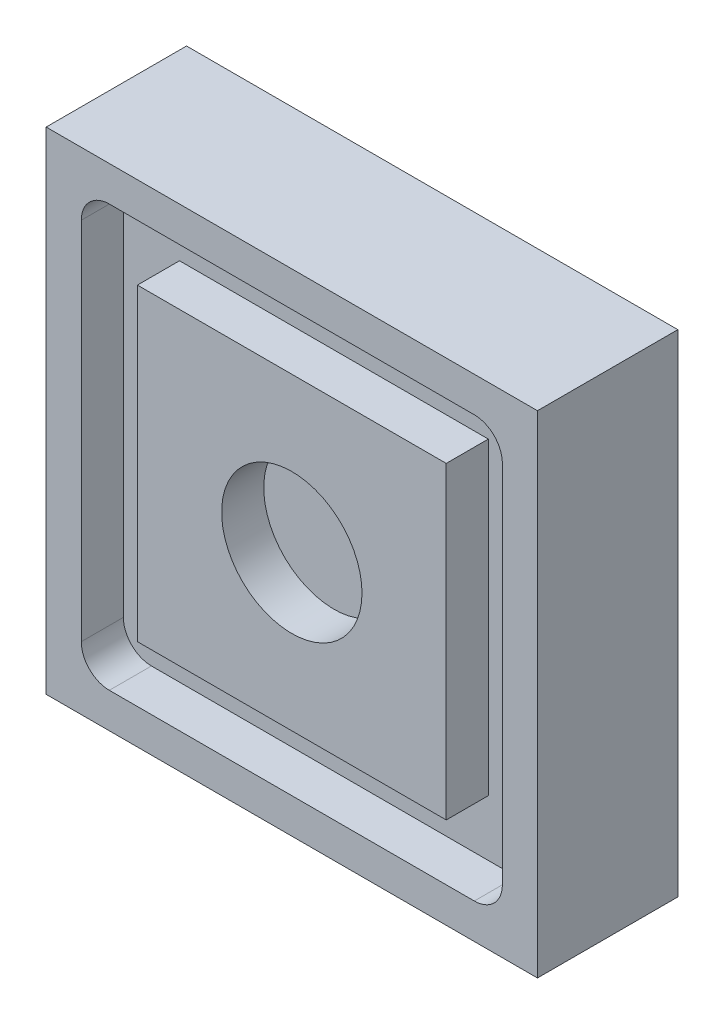
ISO-10303-21;
HEADER;
FILE_DESCRIPTION(('STEP AP214'),'2;1');
FILE_NAME('part.step','',(''),(''),'','','');
FILE_SCHEMA(('AUTOMOTIVE_DESIGN { 1 0 10303 214 1 1 1 1 }'));
ENDSEC;
DATA;
#1=APPLICATION_CONTEXT('core data for automotive mechanical design processes');
#2=APPLICATION_PROTOCOL_DEFINITION('international standard','automotive_design',2000,#1);
#3=PRODUCT_CONTEXT('',#1,'mechanical');
#4=PRODUCT('Part','Part','',(#3));
#5=PRODUCT_RELATED_PRODUCT_CATEGORY('part','',(#4));
#6=PRODUCT_DEFINITION_FORMATION('','',#4);
#7=PRODUCT_DEFINITION_CONTEXT('part definition',#1,'design');
#8=PRODUCT_DEFINITION('design','',#6,#7);
#9=PRODUCT_DEFINITION_SHAPE('','',#8);
#10=(LENGTH_UNIT() NAMED_UNIT(*) SI_UNIT(.MILLI.,.METRE.));
#11=(NAMED_UNIT(*) PLANE_ANGLE_UNIT() SI_UNIT($,.RADIAN.));
#12=(NAMED_UNIT(*) SI_UNIT($,.STERADIAN.) SOLID_ANGLE_UNIT());
#13=UNCERTAINTY_MEASURE_WITH_UNIT(LENGTH_MEASURE(1.E-05),#10,'distance_accuracy_value','');
#14=(GEOMETRIC_REPRESENTATION_CONTEXT(3) GLOBAL_UNCERTAINTY_ASSIGNED_CONTEXT((#13)) GLOBAL_UNIT_ASSIGNED_CONTEXT((#10,
#11,#12)) REPRESENTATION_CONTEXT('',''));
#15=CARTESIAN_POINT('',(0.,0.,0.));
#16=DIRECTION('',(0.,0.,1.));
#17=DIRECTION('',(1.,0.,0.));
#18=AXIS2_PLACEMENT_3D('',#15,#16,#17);
#19=CARTESIAN_POINT('',(-17.5,-17.5,10.));
#20=DIRECTION('',(1.,0.,0.));
#21=DIRECTION('',(0.,0.,-1.));
#22=AXIS2_PLACEMENT_3D('',#19,#20,#21);
#23=PLANE('',#22);
#24=DIRECTION('',(0.,-1.,0.));
#25=VECTOR('',#24,1.);
#26=CARTESIAN_POINT('',(-17.5,-17.5,0.));
#27=LINE('',#26,#25);
#28=CARTESIAN_POINT('',(-17.5,17.5,0.));
#29=VERTEX_POINT('',#28);
#30=CARTESIAN_POINT('',(-17.5,-17.5,0.));
#31=VERTEX_POINT('',#30);
#32=EDGE_CURVE('E395',#29,#31,#27,.T.);
#33=ORIENTED_EDGE('',*,*,#32,.T.);
#34=DIRECTION('',(0.,0.,-1.));
#35=VECTOR('',#34,1.);
#36=CARTESIAN_POINT('',(-17.5,-17.5,10.));
#37=LINE('',#36,#35);
#38=CARTESIAN_POINT('',(-17.5,-17.5,10.));
#39=VERTEX_POINT('',#38);
#40=EDGE_CURVE('E13',#39,#31,#37,.T.);
#41=ORIENTED_EDGE('',*,*,#40,.F.);
#42=DIRECTION('',(0.,-1.,0.));
#43=VECTOR('',#42,1.);
#44=CARTESIAN_POINT('',(-17.5,-17.5,10.));
#45=LINE('',#44,#43);
#46=CARTESIAN_POINT('',(-17.5,17.5,10.));
#47=VERTEX_POINT('',#46);
#48=EDGE_CURVE('E346',#47,#39,#45,.T.);
#49=ORIENTED_EDGE('',*,*,#48,.F.);
#50=DIRECTION('',(0.,0.,-1.));
#51=VECTOR('',#50,1.);
#52=CARTESIAN_POINT('',(-17.5,17.5,10.));
#53=LINE('',#52,#51);
#54=EDGE_CURVE('E436',#47,#29,#53,.T.);
#55=ORIENTED_EDGE('',*,*,#54,.T.);
#56=EDGE_LOOP('',(#33,#41,#49,#55));
#57=FACE_BOUND('',#56,.T.);
#58=ADVANCED_FACE('F82',(#57),#23,.F.);
#59=CARTESIAN_POINT('',(17.5,-17.5,10.));
#60=DIRECTION('',(0.,1.,0.));
#61=DIRECTION('',(-1.,0.,0.));
#62=AXIS2_PLACEMENT_3D('',#59,#60,#61);
#63=PLANE('',#62);
#64=DIRECTION('',(1.,0.,0.));
#65=VECTOR('',#64,1.);
#66=CARTESIAN_POINT('',(17.5,-17.5,0.));
#67=LINE('',#66,#65);
#68=CARTESIAN_POINT('',(17.5,-17.5,0.));
#69=VERTEX_POINT('',#68);
#70=EDGE_CURVE('E437',#31,#69,#67,.T.);
#71=ORIENTED_EDGE('',*,*,#70,.T.);
#72=DIRECTION('',(0.,0.,-1.));
#73=VECTOR('',#72,1.);
#74=CARTESIAN_POINT('',(17.5,-17.5,10.));
#75=LINE('',#74,#73);
#76=CARTESIAN_POINT('',(17.5,-17.5,10.));
#77=VERTEX_POINT('',#76);
#78=EDGE_CURVE('E86',#77,#69,#75,.T.);
#79=ORIENTED_EDGE('',*,*,#78,.F.);
#80=DIRECTION('',(1.,0.,0.));
#81=VECTOR('',#80,1.);
#82=CARTESIAN_POINT('',(17.5,-17.5,10.));
#83=LINE('',#82,#81);
#84=EDGE_CURVE('E462',#39,#77,#83,.T.);
#85=ORIENTED_EDGE('',*,*,#84,.F.);
#86=ORIENTED_EDGE('',*,*,#40,.T.);
#87=EDGE_LOOP('',(#71,#79,#85,#86));
#88=FACE_BOUND('',#87,.T.);
#89=ADVANCED_FACE('F425',(#88),#63,.F.);
#90=CARTESIAN_POINT('',(17.5,-17.5,10.));
#91=DIRECTION('',(-1.,0.,0.));
#92=DIRECTION('',(0.,0.,1.));
#93=AXIS2_PLACEMENT_3D('',#90,#91,#92);
#94=PLANE('',#93);
#95=DIRECTION('',(0.,1.,0.));
#96=VECTOR('',#95,1.);
#97=CARTESIAN_POINT('',(17.5,-17.5,0.));
#98=LINE('',#97,#96);
#99=CARTESIAN_POINT('',(17.5,17.5,0.));
#100=VERTEX_POINT('',#99);
#101=EDGE_CURVE('E439',#69,#100,#98,.T.);
#102=ORIENTED_EDGE('',*,*,#101,.T.);
#103=DIRECTION('',(0.,0.,-1.));
#104=VECTOR('',#103,1.);
#105=CARTESIAN_POINT('',(17.5,17.5,10.));
#106=LINE('',#105,#104);
#107=CARTESIAN_POINT('',(17.5,17.5,10.));
#108=VERTEX_POINT('',#107);
#109=EDGE_CURVE('E446',#108,#100,#106,.T.);
#110=ORIENTED_EDGE('',*,*,#109,.F.);
#111=DIRECTION('',(0.,1.,0.));
#112=VECTOR('',#111,1.);
#113=CARTESIAN_POINT('',(17.5,-17.5,10.));
#114=LINE('',#113,#112);
#115=EDGE_CURVE('E456',#77,#108,#114,.T.);
#116=ORIENTED_EDGE('',*,*,#115,.F.);
#117=ORIENTED_EDGE('',*,*,#78,.T.);
#118=EDGE_LOOP('',(#102,#110,#116,#117));
#119=FACE_BOUND('',#118,.T.);
#120=ADVANCED_FACE('F428',(#119),#94,.F.);
#121=CARTESIAN_POINT('',(17.5,17.5,10.));
#122=DIRECTION('',(0.,-1.,0.));
#123=DIRECTION('',(1.,0.,0.));
#124=AXIS2_PLACEMENT_3D('',#121,#122,#123);
#125=PLANE('',#124);
#126=DIRECTION('',(-1.,0.,0.));
#127=VECTOR('',#126,1.);
#128=CARTESIAN_POINT('',(17.5,17.5,0.));
#129=LINE('',#128,#127);
#130=EDGE_CURVE('E449',#100,#29,#129,.T.);
#131=ORIENTED_EDGE('',*,*,#130,.T.);
#132=ORIENTED_EDGE('',*,*,#54,.F.);
#133=DIRECTION('',(-1.,0.,0.));
#134=VECTOR('',#133,1.);
#135=CARTESIAN_POINT('',(17.5,17.5,10.));
#136=LINE('',#135,#134);
#137=EDGE_CURVE('E444',#108,#47,#136,.T.);
#138=ORIENTED_EDGE('',*,*,#137,.F.);
#139=ORIENTED_EDGE('',*,*,#109,.T.);
#140=EDGE_LOOP('',(#131,#132,#138,#139));
#141=FACE_BOUND('',#140,.T.);
#142=ADVANCED_FACE('F458',(#141),#125,.F.);
#143=CARTESIAN_POINT('',(0.,0.,10.));
#144=DIRECTION('',(0.,0.,1.));
#145=DIRECTION('',(1.,0.,0.));
#146=AXIS2_PLACEMENT_3D('',#143,#144,#145);
#147=PLANE('',#146);
#148=CARTESIAN_POINT('',(-13.,-13.,10.));
#149=DIRECTION('',(0.,0.,1.));
#150=DIRECTION('',(-1.,0.,0.));
#151=AXIS2_PLACEMENT_3D('',#148,#149,#150);
#152=CIRCLE('',#151,2.);
#153=CARTESIAN_POINT('',(-15.,-13.,10.));
#154=VERTEX_POINT('',#153);
#155=CARTESIAN_POINT('',(-13.,-15.,10.));
#156=VERTEX_POINT('',#155);
#157=EDGE_CURVE('E92',#154,#156,#152,.T.);
#158=ORIENTED_EDGE('',*,*,#157,.F.);
#159=DIRECTION('',(0.,-1.,0.));
#160=VECTOR('',#159,1.);
#161=CARTESIAN_POINT('',(-15.,-13.,10.));
#162=LINE('',#161,#160);
#163=CARTESIAN_POINT('',(-15.,13.,10.));
#164=VERTEX_POINT('',#163);
#165=EDGE_CURVE('E310',#164,#154,#162,.T.);
#166=ORIENTED_EDGE('',*,*,#165,.F.);
#167=CARTESIAN_POINT('',(-13.,13.,10.));
#168=DIRECTION('',(0.,0.,1.));
#169=DIRECTION('',(1.,0.,0.));
#170=AXIS2_PLACEMENT_3D('',#167,#168,#169);
#171=CIRCLE('',#170,2.);
#172=CARTESIAN_POINT('',(-13.,15.,10.));
#173=VERTEX_POINT('',#172);
#174=EDGE_CURVE('E296',#173,#164,#171,.T.);
#175=ORIENTED_EDGE('',*,*,#174,.F.);
#176=DIRECTION('',(-1.,0.,0.));
#177=VECTOR('',#176,1.);
#178=CARTESIAN_POINT('',(13.,15.,10.));
#179=LINE('',#178,#177);
#180=CARTESIAN_POINT('',(13.,15.,10.));
#181=VERTEX_POINT('',#180);
#182=EDGE_CURVE('E292',#181,#173,#179,.T.);
#183=ORIENTED_EDGE('',*,*,#182,.F.);
#184=CARTESIAN_POINT('',(13.,13.,10.));
#185=DIRECTION('',(0.,0.,1.));
#186=DIRECTION('',(1.,0.,0.));
#187=AXIS2_PLACEMENT_3D('',#184,#185,#186);
#188=CIRCLE('',#187,2.);
#189=CARTESIAN_POINT('',(15.,13.,10.));
#190=VERTEX_POINT('',#189);
#191=EDGE_CURVE('E286',#190,#181,#188,.T.);
#192=ORIENTED_EDGE('',*,*,#191,.F.);
#193=DIRECTION('',(0.,1.,0.));
#194=VECTOR('',#193,1.);
#195=CARTESIAN_POINT('',(15.,-13.,10.));
#196=LINE('',#195,#194);
#197=CARTESIAN_POINT('',(15.,-13.,10.));
#198=VERTEX_POINT('',#197);
#199=EDGE_CURVE('E295',#198,#190,#196,.T.);
#200=ORIENTED_EDGE('',*,*,#199,.F.);
#201=CARTESIAN_POINT('',(13.,-13.,10.));
#202=DIRECTION('',(0.,0.,1.));
#203=DIRECTION('',(1.,0.,0.));
#204=AXIS2_PLACEMENT_3D('',#201,#202,#203);
#205=CIRCLE('',#204,2.);
#206=CARTESIAN_POINT('',(13.,-15.,10.));
#207=VERTEX_POINT('',#206);
#208=EDGE_CURVE('E269',#207,#198,#205,.T.);
#209=ORIENTED_EDGE('',*,*,#208,.F.);
#210=DIRECTION('',(1.,0.,0.));
#211=VECTOR('',#210,1.);
#212=CARTESIAN_POINT('',(13.,-15.,10.));
#213=LINE('',#212,#211);
#214=EDGE_CURVE('E270',#156,#207,#213,.T.);
#215=ORIENTED_EDGE('',*,*,#214,.F.);
#216=EDGE_LOOP('',(#158,#166,#175,#183,#192,#200,#209,#215));
#217=FACE_BOUND('',#216,.T.);
#218=ORIENTED_EDGE('',*,*,#48,.T.);
#219=ORIENTED_EDGE('',*,*,#84,.T.);
#220=ORIENTED_EDGE('',*,*,#115,.T.);
#221=ORIENTED_EDGE('',*,*,#137,.T.);
#222=EDGE_LOOP('',(#218,#219,#220,#221));
#223=FACE_BOUND('',#222,.T.);
#224=ADVANCED_FACE('F374',(#217,#223),#147,.T.);
#225=CARTESIAN_POINT('',(0.,0.,0.));
#226=DIRECTION('',(0.,0.,1.));
#227=DIRECTION('',(1.,0.,0.));
#228=AXIS2_PLACEMENT_3D('',#225,#226,#227);
#229=PLANE('',#228);
#230=ORIENTED_EDGE('',*,*,#32,.F.);
#231=ORIENTED_EDGE('',*,*,#130,.F.);
#232=ORIENTED_EDGE('',*,*,#101,.F.);
#233=ORIENTED_EDGE('',*,*,#70,.F.);
#234=EDGE_LOOP('',(#230,#231,#232,#233));
#235=FACE_BOUND('',#234,.T.);
#236=ADVANCED_FACE('F407',(#235),#229,.F.);
#237=CARTESIAN_POINT('',(-13.,-13.,7.));
#238=DIRECTION('',(0.,0.,1.));
#239=DIRECTION('',(1.,0.,0.));
#240=AXIS2_PLACEMENT_3D('',#237,#238,#239);
#241=CYLINDRICAL_SURFACE('',#240,2.);
#242=ORIENTED_EDGE('',*,*,#157,.T.);
#243=DIRECTION('',(0.,0.,1.));
#244=VECTOR('',#243,1.);
#245=CARTESIAN_POINT('',(-13.,-15.,7.));
#246=LINE('',#245,#244);
#247=CARTESIAN_POINT('',(-13.,-15.,7.));
#248=VERTEX_POINT('',#247);
#249=EDGE_CURVE('E338',#248,#156,#246,.T.);
#250=ORIENTED_EDGE('',*,*,#249,.F.);
#251=CARTESIAN_POINT('',(-13.,-13.,7.));
#252=DIRECTION('',(0.,0.,1.));
#253=DIRECTION('',(-1.,0.,0.));
#254=AXIS2_PLACEMENT_3D('',#251,#252,#253);
#255=CIRCLE('',#254,2.);
#256=CARTESIAN_POINT('',(-15.,-13.,7.));
#257=VERTEX_POINT('',#256);
#258=EDGE_CURVE('E301',#257,#248,#255,.T.);
#259=ORIENTED_EDGE('',*,*,#258,.F.);
#260=DIRECTION('',(0.,0.,1.));
#261=VECTOR('',#260,1.);
#262=CARTESIAN_POINT('',(-15.,-13.,7.));
#263=LINE('',#262,#261);
#264=EDGE_CURVE('E393',#257,#154,#263,.T.);
#265=ORIENTED_EDGE('',*,*,#264,.T.);
#266=EDGE_LOOP('',(#242,#250,#259,#265));
#267=FACE_BOUND('',#266,.T.);
#268=ADVANCED_FACE('F406',(#267),#241,.F.);
#269=CARTESIAN_POINT('',(-15.,-13.,7.));
#270=DIRECTION('',(-1.,0.,0.));
#271=DIRECTION('',(0.,0.,1.));
#272=AXIS2_PLACEMENT_3D('',#269,#270,#271);
#273=PLANE('',#272);
#274=ORIENTED_EDGE('',*,*,#165,.T.);
#275=ORIENTED_EDGE('',*,*,#264,.F.);
#276=DIRECTION('',(0.,-1.,0.));
#277=VECTOR('',#276,1.);
#278=CARTESIAN_POINT('',(-15.,-13.,7.));
#279=LINE('',#278,#277);
#280=CARTESIAN_POINT('',(-15.,13.,7.));
#281=VERTEX_POINT('',#280);
#282=EDGE_CURVE('E273',#281,#257,#279,.T.);
#283=ORIENTED_EDGE('',*,*,#282,.F.);
#284=DIRECTION('',(0.,0.,1.));
#285=VECTOR('',#284,1.);
#286=CARTESIAN_POINT('',(-15.,13.,7.));
#287=LINE('',#286,#285);
#288=EDGE_CURVE('E391',#281,#164,#287,.T.);
#289=ORIENTED_EDGE('',*,*,#288,.T.);
#290=EDGE_LOOP('',(#274,#275,#283,#289));
#291=FACE_BOUND('',#290,.T.);
#292=ADVANCED_FACE('F403',(#291),#273,.F.);
#293=CARTESIAN_POINT('',(-13.,13.,7.));
#294=DIRECTION('',(0.,0.,1.));
#295=DIRECTION('',(1.,0.,0.));
#296=AXIS2_PLACEMENT_3D('',#293,#294,#295);
#297=CYLINDRICAL_SURFACE('',#296,2.);
#298=ORIENTED_EDGE('',*,*,#174,.T.);
#299=ORIENTED_EDGE('',*,*,#288,.F.);
#300=CARTESIAN_POINT('',(-13.,13.,7.));
#301=DIRECTION('',(0.,0.,1.));
#302=DIRECTION('',(1.,0.,0.));
#303=AXIS2_PLACEMENT_3D('',#300,#301,#302);
#304=CIRCLE('',#303,2.);
#305=CARTESIAN_POINT('',(-13.,15.,7.));
#306=VERTEX_POINT('',#305);
#307=EDGE_CURVE('E329',#306,#281,#304,.T.);
#308=ORIENTED_EDGE('',*,*,#307,.F.);
#309=DIRECTION('',(0.,0.,1.));
#310=VECTOR('',#309,1.);
#311=CARTESIAN_POINT('',(-13.,15.,7.));
#312=LINE('',#311,#310);
#313=EDGE_CURVE('E397',#306,#173,#312,.T.);
#314=ORIENTED_EDGE('',*,*,#313,.T.);
#315=EDGE_LOOP('',(#298,#299,#308,#314));
#316=FACE_BOUND('',#315,.T.);
#317=ADVANCED_FACE('F404',(#316),#297,.F.);
#318=CARTESIAN_POINT('',(13.,15.,7.));
#319=DIRECTION('',(0.,1.,0.));
#320=DIRECTION('',(-1.,0.,0.));
#321=AXIS2_PLACEMENT_3D('',#318,#319,#320);
#322=PLANE('',#321);
#323=ORIENTED_EDGE('',*,*,#182,.T.);
#324=ORIENTED_EDGE('',*,*,#313,.F.);
#325=DIRECTION('',(-1.,0.,0.));
#326=VECTOR('',#325,1.);
#327=CARTESIAN_POINT('',(13.,15.,7.));
#328=LINE('',#327,#326);
#329=CARTESIAN_POINT('',(13.,15.,7.));
#330=VERTEX_POINT('',#329);
#331=EDGE_CURVE('E330',#330,#306,#328,.T.);
#332=ORIENTED_EDGE('',*,*,#331,.F.);
#333=DIRECTION('',(0.,0.,1.));
#334=VECTOR('',#333,1.);
#335=CARTESIAN_POINT('',(13.,15.,7.));
#336=LINE('',#335,#334);
#337=EDGE_CURVE('E358',#330,#181,#336,.T.);
#338=ORIENTED_EDGE('',*,*,#337,.T.);
#339=EDGE_LOOP('',(#323,#324,#332,#338));
#340=FACE_BOUND('',#339,.T.);
#341=ADVANCED_FACE('F401',(#340),#322,.F.);
#342=CARTESIAN_POINT('',(13.,13.,7.));
#343=DIRECTION('',(0.,0.,1.));
#344=DIRECTION('',(1.,0.,0.));
#345=AXIS2_PLACEMENT_3D('',#342,#343,#344);
#346=CYLINDRICAL_SURFACE('',#345,2.);
#347=ORIENTED_EDGE('',*,*,#191,.T.);
#348=ORIENTED_EDGE('',*,*,#337,.F.);
#349=CARTESIAN_POINT('',(13.,13.,7.));
#350=DIRECTION('',(0.,0.,1.));
#351=DIRECTION('',(1.,0.,0.));
#352=AXIS2_PLACEMENT_3D('',#349,#350,#351);
#353=CIRCLE('',#352,2.);
#354=CARTESIAN_POINT('',(15.,13.,7.));
#355=VERTEX_POINT('',#354);
#356=EDGE_CURVE('E322',#355,#330,#353,.T.);
#357=ORIENTED_EDGE('',*,*,#356,.F.);
#358=DIRECTION('',(0.,0.,1.));
#359=VECTOR('',#358,1.);
#360=CARTESIAN_POINT('',(15.,13.,7.));
#361=LINE('',#360,#359);
#362=EDGE_CURVE('E354',#355,#190,#361,.T.);
#363=ORIENTED_EDGE('',*,*,#362,.T.);
#364=EDGE_LOOP('',(#347,#348,#357,#363));
#365=FACE_BOUND('',#364,.T.);
#366=ADVANCED_FACE('F379',(#365),#346,.F.);
#367=CARTESIAN_POINT('',(15.,-13.,7.));
#368=DIRECTION('',(1.,0.,0.));
#369=DIRECTION('',(0.,0.,-1.));
#370=AXIS2_PLACEMENT_3D('',#367,#368,#369);
#371=PLANE('',#370);
#372=ORIENTED_EDGE('',*,*,#199,.T.);
#373=ORIENTED_EDGE('',*,*,#362,.F.);
#374=DIRECTION('',(0.,1.,0.));
#375=VECTOR('',#374,1.);
#376=CARTESIAN_POINT('',(15.,-13.,7.));
#377=LINE('',#376,#375);
#378=CARTESIAN_POINT('',(15.,-13.,7.));
#379=VERTEX_POINT('',#378);
#380=EDGE_CURVE('E320',#379,#355,#377,.T.);
#381=ORIENTED_EDGE('',*,*,#380,.F.);
#382=DIRECTION('',(0.,0.,1.));
#383=VECTOR('',#382,1.);
#384=CARTESIAN_POINT('',(15.,-13.,7.));
#385=LINE('',#384,#383);
#386=EDGE_CURVE('E345',#379,#198,#385,.T.);
#387=ORIENTED_EDGE('',*,*,#386,.T.);
#388=EDGE_LOOP('',(#372,#373,#381,#387));
#389=FACE_BOUND('',#388,.T.);
#390=ADVANCED_FACE('F368',(#389),#371,.F.);
#391=CARTESIAN_POINT('',(13.,-13.,7.));
#392=DIRECTION('',(0.,0.,1.));
#393=DIRECTION('',(1.,0.,0.));
#394=AXIS2_PLACEMENT_3D('',#391,#392,#393);
#395=CYLINDRICAL_SURFACE('',#394,2.);
#396=ORIENTED_EDGE('',*,*,#208,.T.);
#397=ORIENTED_EDGE('',*,*,#386,.F.);
#398=CARTESIAN_POINT('',(13.,-13.,7.));
#399=DIRECTION('',(0.,0.,1.));
#400=DIRECTION('',(1.,0.,0.));
#401=AXIS2_PLACEMENT_3D('',#398,#399,#400);
#402=CIRCLE('',#401,2.);
#403=CARTESIAN_POINT('',(13.,-15.,7.));
#404=VERTEX_POINT('',#403);
#405=EDGE_CURVE('E311',#404,#379,#402,.T.);
#406=ORIENTED_EDGE('',*,*,#405,.F.);
#407=DIRECTION('',(0.,0.,1.));
#408=VECTOR('',#407,1.);
#409=CARTESIAN_POINT('',(13.,-15.,7.));
#410=LINE('',#409,#408);
#411=EDGE_CURVE('E339',#404,#207,#410,.T.);
#412=ORIENTED_EDGE('',*,*,#411,.T.);
#413=EDGE_LOOP('',(#396,#397,#406,#412));
#414=FACE_BOUND('',#413,.T.);
#415=ADVANCED_FACE('F373',(#414),#395,.F.);
#416=CARTESIAN_POINT('',(13.,-15.,7.));
#417=DIRECTION('',(0.,-1.,0.));
#418=DIRECTION('',(1.,0.,0.));
#419=AXIS2_PLACEMENT_3D('',#416,#417,#418);
#420=PLANE('',#419);
#421=ORIENTED_EDGE('',*,*,#214,.T.);
#422=ORIENTED_EDGE('',*,*,#411,.F.);
#423=DIRECTION('',(1.,0.,0.));
#424=VECTOR('',#423,1.);
#425=CARTESIAN_POINT('',(13.,-15.,7.));
#426=LINE('',#425,#424);
#427=EDGE_CURVE('E306',#248,#404,#426,.T.);
#428=ORIENTED_EDGE('',*,*,#427,.F.);
#429=ORIENTED_EDGE('',*,*,#249,.T.);
#430=EDGE_LOOP('',(#421,#422,#428,#429));
#431=FACE_BOUND('',#430,.T.);
#432=ADVANCED_FACE('F383',(#431),#420,.F.);
#433=CARTESIAN_POINT('',(-13.,-13.,7.));
#434=DIRECTION('',(0.,0.,1.));
#435=DIRECTION('',(1.,0.,0.));
#436=AXIS2_PLACEMENT_3D('',#433,#434,#435);
#437=PLANE('',#436);
#438=DIRECTION('',(-1.,0.,0.));
#439=VECTOR('',#438,1.);
#440=CARTESIAN_POINT('',(-13.,11.,7.));
#441=LINE('',#440,#439);
#442=CARTESIAN_POINT('',(11.,11.,7.));
#443=VERTEX_POINT('',#442);
#444=CARTESIAN_POINT('',(-11.,11.,7.));
#445=VERTEX_POINT('',#444);
#446=EDGE_CURVE('E202',#443,#445,#441,.T.);
#447=ORIENTED_EDGE('',*,*,#446,.F.);
#448=DIRECTION('',(0.,1.,0.));
#449=VECTOR('',#448,1.);
#450=CARTESIAN_POINT('',(11.,-13.,7.));
#451=LINE('',#450,#449);
#452=CARTESIAN_POINT('',(11.,-11.,7.));
#453=VERTEX_POINT('',#452);
#454=EDGE_CURVE('E212',#453,#443,#451,.T.);
#455=ORIENTED_EDGE('',*,*,#454,.F.);
#456=DIRECTION('',(1.,0.,0.));
#457=VECTOR('',#456,1.);
#458=CARTESIAN_POINT('',(-13.,-11.,7.));
#459=LINE('',#458,#457);
#460=CARTESIAN_POINT('',(-11.,-11.,7.));
#461=VERTEX_POINT('',#460);
#462=EDGE_CURVE('E197',#461,#453,#459,.T.);
#463=ORIENTED_EDGE('',*,*,#462,.F.);
#464=DIRECTION('',(0.,-1.,0.));
#465=VECTOR('',#464,1.);
#466=CARTESIAN_POINT('',(-11.,-13.,7.));
#467=LINE('',#466,#465);
#468=EDGE_CURVE('E211',#445,#461,#467,.T.);
#469=ORIENTED_EDGE('',*,*,#468,.F.);
#470=EDGE_LOOP('',(#447,#455,#463,#469));
#471=FACE_BOUND('',#470,.T.);
#472=ORIENTED_EDGE('',*,*,#258,.T.);
#473=ORIENTED_EDGE('',*,*,#427,.T.);
#474=ORIENTED_EDGE('',*,*,#405,.T.);
#475=ORIENTED_EDGE('',*,*,#380,.T.);
#476=ORIENTED_EDGE('',*,*,#356,.T.);
#477=ORIENTED_EDGE('',*,*,#331,.T.);
#478=ORIENTED_EDGE('',*,*,#307,.T.);
#479=ORIENTED_EDGE('',*,*,#282,.T.);
#480=EDGE_LOOP('',(#472,#473,#474,#475,#476,#477,#478,#479));
#481=FACE_BOUND('',#480,.T.);
#482=ADVANCED_FACE('F207',(#471,#481),#437,.T.);
#483=CARTESIAN_POINT('',(-11.,-13.,7.));
#484=DIRECTION('',(-1.,0.,0.));
#485=DIRECTION('',(0.,0.,1.));
#486=AXIS2_PLACEMENT_3D('',#483,#484,#485);
#487=PLANE('',#486);
#488=DIRECTION('',(0.,-1.,0.));
#489=VECTOR('',#488,1.);
#490=CARTESIAN_POINT('',(-11.,-13.,10.));
#491=LINE('',#490,#489);
#492=CARTESIAN_POINT('',(-11.,11.,10.));
#493=VERTEX_POINT('',#492);
#494=CARTESIAN_POINT('',(-11.,-11.,10.));
#495=VERTEX_POINT('',#494);
#496=EDGE_CURVE('E236',#493,#495,#491,.T.);
#497=ORIENTED_EDGE('',*,*,#496,.F.);
#498=DIRECTION('',(0.,0.,1.));
#499=VECTOR('',#498,1.);
#500=CARTESIAN_POINT('',(-11.,11.,7.));
#501=LINE('',#500,#499);
#502=EDGE_CURVE('E220',#445,#493,#501,.T.);
#503=ORIENTED_EDGE('',*,*,#502,.F.);
#504=ORIENTED_EDGE('',*,*,#468,.T.);
#505=DIRECTION('',(0.,0.,1.));
#506=VECTOR('',#505,1.);
#507=CARTESIAN_POINT('',(-11.,-11.,7.));
#508=LINE('',#507,#506);
#509=EDGE_CURVE('E194',#461,#495,#508,.T.);
#510=ORIENTED_EDGE('',*,*,#509,.T.);
#511=EDGE_LOOP('',(#497,#503,#504,#510));
#512=FACE_BOUND('',#511,.T.);
#513=ADVANCED_FACE('F216',(#512),#487,.T.);
#514=CARTESIAN_POINT('',(-13.,11.,7.));
#515=DIRECTION('',(0.,1.,0.));
#516=DIRECTION('',(-1.,0.,0.));
#517=AXIS2_PLACEMENT_3D('',#514,#515,#516);
#518=PLANE('',#517);
#519=DIRECTION('',(-1.,0.,0.));
#520=VECTOR('',#519,1.);
#521=CARTESIAN_POINT('',(-13.,11.,10.));
#522=LINE('',#521,#520);
#523=CARTESIAN_POINT('',(11.,11.,10.));
#524=VERTEX_POINT('',#523);
#525=EDGE_CURVE('E217',#524,#493,#522,.T.);
#526=ORIENTED_EDGE('',*,*,#525,.F.);
#527=DIRECTION('',(0.,0.,1.));
#528=VECTOR('',#527,1.);
#529=CARTESIAN_POINT('',(11.,11.,7.));
#530=LINE('',#529,#528);
#531=EDGE_CURVE('E254',#443,#524,#530,.T.);
#532=ORIENTED_EDGE('',*,*,#531,.F.);
#533=ORIENTED_EDGE('',*,*,#446,.T.);
#534=ORIENTED_EDGE('',*,*,#502,.T.);
#535=EDGE_LOOP('',(#526,#532,#533,#534));
#536=FACE_BOUND('',#535,.T.);
#537=ADVANCED_FACE('F255',(#536),#518,.T.);
#538=CARTESIAN_POINT('',(11.,-13.,7.));
#539=DIRECTION('',(1.,0.,0.));
#540=DIRECTION('',(0.,0.,-1.));
#541=AXIS2_PLACEMENT_3D('',#538,#539,#540);
#542=PLANE('',#541);
#543=DIRECTION('',(0.,1.,0.));
#544=VECTOR('',#543,1.);
#545=CARTESIAN_POINT('',(11.,-13.,10.));
#546=LINE('',#545,#544);
#547=CARTESIAN_POINT('',(11.,-11.,10.));
#548=VERTEX_POINT('',#547);
#549=EDGE_CURVE('E103',#548,#524,#546,.T.);
#550=ORIENTED_EDGE('',*,*,#549,.F.);
#551=DIRECTION('',(0.,0.,1.));
#552=VECTOR('',#551,1.);
#553=CARTESIAN_POINT('',(11.,-11.,7.));
#554=LINE('',#553,#552);
#555=EDGE_CURVE('E204',#453,#548,#554,.T.);
#556=ORIENTED_EDGE('',*,*,#555,.F.);
#557=ORIENTED_EDGE('',*,*,#454,.T.);
#558=ORIENTED_EDGE('',*,*,#531,.T.);
#559=EDGE_LOOP('',(#550,#556,#557,#558));
#560=FACE_BOUND('',#559,.T.);
#561=ADVANCED_FACE('F258',(#560),#542,.T.);
#562=CARTESIAN_POINT('',(-13.,-11.,7.));
#563=DIRECTION('',(0.,-1.,0.));
#564=DIRECTION('',(1.,0.,0.));
#565=AXIS2_PLACEMENT_3D('',#562,#563,#564);
#566=PLANE('',#565);
#567=DIRECTION('',(1.,0.,0.));
#568=VECTOR('',#567,1.);
#569=CARTESIAN_POINT('',(-13.,-11.,10.));
#570=LINE('',#569,#568);
#571=EDGE_CURVE('E200',#495,#548,#570,.T.);
#572=ORIENTED_EDGE('',*,*,#571,.F.);
#573=ORIENTED_EDGE('',*,*,#509,.F.);
#574=ORIENTED_EDGE('',*,*,#462,.T.);
#575=ORIENTED_EDGE('',*,*,#555,.T.);
#576=EDGE_LOOP('',(#572,#573,#574,#575));
#577=FACE_BOUND('',#576,.T.);
#578=ADVANCED_FACE('F198',(#577),#566,.T.);
#579=CARTESIAN_POINT('',(0.,0.,10.));
#580=DIRECTION('',(0.,0.,1.));
#581=DIRECTION('',(1.,0.,0.));
#582=AXIS2_PLACEMENT_3D('',#579,#580,#581);
#583=CIRCLE('',#582,5.);
#584=CARTESIAN_POINT('',(5.,0.,10.));
#585=VERTEX_POINT('',#584);
#586=EDGE_CURVE('E221',#585,#585,#583,.T.);
#587=ORIENTED_EDGE('',*,*,#586,.F.);
#588=EDGE_LOOP('',(#587));
#589=FACE_BOUND('',#588,.T.);
#590=ORIENTED_EDGE('',*,*,#525,.T.);
#591=ORIENTED_EDGE('',*,*,#496,.T.);
#592=ORIENTED_EDGE('',*,*,#571,.T.);
#593=ORIENTED_EDGE('',*,*,#549,.T.);
#594=EDGE_LOOP('',(#590,#591,#592,#593));
#595=FACE_BOUND('',#594,.T.);
#596=ADVANCED_FACE('F464',(#589,#595),#147,.T.);
#597=CARTESIAN_POINT('',(0.,0.,7.));
#598=DIRECTION('',(0.,0.,1.));
#599=DIRECTION('',(1.,0.,0.));
#600=AXIS2_PLACEMENT_3D('',#597,#598,#599);
#601=CYLINDRICAL_SURFACE('',#600,5.);
#602=CARTESIAN_POINT('',(0.,0.,7.));
#603=DIRECTION('',(0.,0.,1.));
#604=DIRECTION('',(1.,0.,0.));
#605=AXIS2_PLACEMENT_3D('',#602,#603,#604);
#606=CIRCLE('',#605,5.);
#607=CARTESIAN_POINT('',(5.,0.,7.));
#608=VERTEX_POINT('',#607);
#609=EDGE_CURVE('E486',#608,#608,#606,.T.);
#610=ORIENTED_EDGE('',*,*,#609,.F.);
#611=EDGE_LOOP('',(#610));
#612=FACE_BOUND('',#611,.T.);
#613=ORIENTED_EDGE('',*,*,#586,.T.);
#614=EDGE_LOOP('',(#613));
#615=FACE_BOUND('',#614,.T.);
#616=ADVANCED_FACE('F471',(#612,#615),#601,.F.);
#617=CARTESIAN_POINT('',(0.,0.,7.));
#618=DIRECTION('',(0.,0.,1.));
#619=DIRECTION('',(1.,0.,0.));
#620=AXIS2_PLACEMENT_3D('',#617,#618,#619);
#621=PLANE('',#620);
#622=ORIENTED_EDGE('',*,*,#609,.T.);
#623=EDGE_LOOP('',(#622));
#624=FACE_BOUND('',#623,.T.);
#625=ADVANCED_FACE('F476',(#624),#621,.T.);
#626=CLOSED_SHELL('',(#58,#89,#120,#142,#224,#236,#268,#292,#317,#341,#366,#390,#415,#432,#482,
#513,#537,#561,#578,#596,#616,#625));
#627=MANIFOLD_SOLID_BREP('B2',#626);
#628=ADVANCED_BREP_SHAPE_REPRESENTATION('',(#18,#627),#14);
#629=SHAPE_DEFINITION_REPRESENTATION(#9,#628);
ENDSEC;
END-ISO-10303-21;
